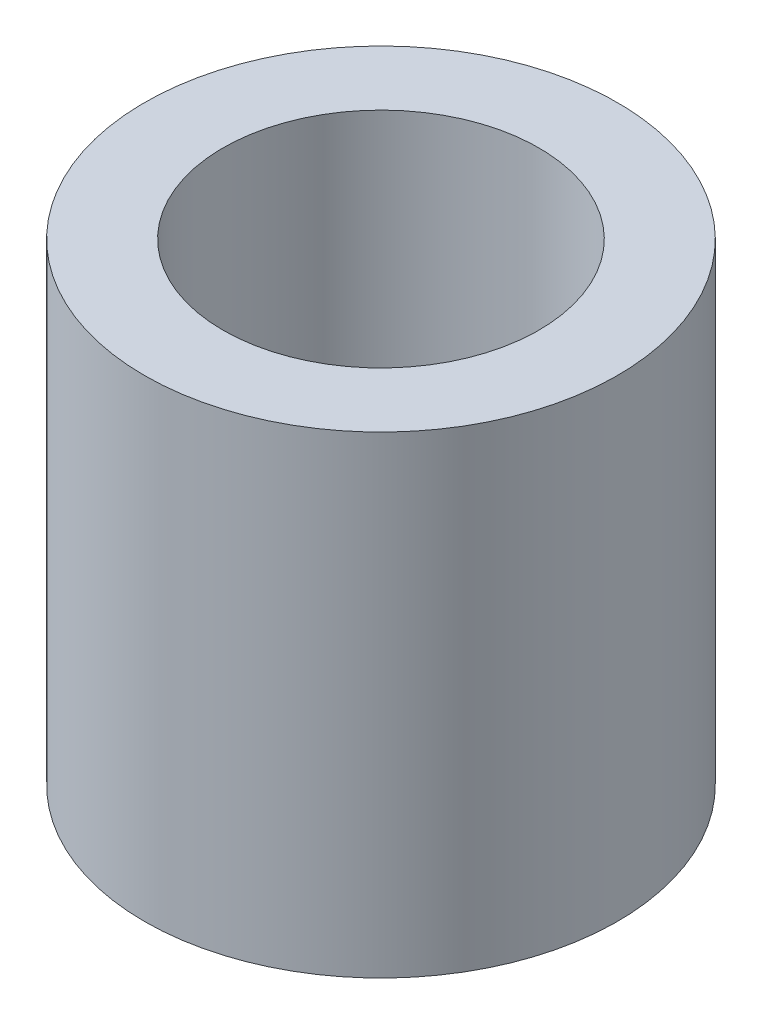
ISO-10303-21;
HEADER;
FILE_DESCRIPTION(('STEP AP214'),'2;1');
FILE_NAME('part.step','',(''),(''),'','','');
FILE_SCHEMA(('AUTOMOTIVE_DESIGN { 1 0 10303 214 1 1 1 1 }'));
ENDSEC;
DATA;
#1=APPLICATION_CONTEXT('core data for automotive mechanical design processes');
#2=APPLICATION_PROTOCOL_DEFINITION('international standard','automotive_design',2000,#1);
#3=PRODUCT_CONTEXT('',#1,'mechanical');
#4=PRODUCT('Part','Part','',(#3));
#5=PRODUCT_RELATED_PRODUCT_CATEGORY('part','',(#4));
#6=PRODUCT_DEFINITION_FORMATION('','',#4);
#7=PRODUCT_DEFINITION_CONTEXT('part definition',#1,'design');
#8=PRODUCT_DEFINITION('design','',#6,#7);
#9=PRODUCT_DEFINITION_SHAPE('','',#8);
#10=(LENGTH_UNIT() NAMED_UNIT(*) SI_UNIT(.MILLI.,.METRE.));
#11=(NAMED_UNIT(*) PLANE_ANGLE_UNIT() SI_UNIT($,.RADIAN.));
#12=(NAMED_UNIT(*) SI_UNIT($,.STERADIAN.) SOLID_ANGLE_UNIT());
#13=UNCERTAINTY_MEASURE_WITH_UNIT(LENGTH_MEASURE(1.E-05),#10,'distance_accuracy_value','');
#14=(GEOMETRIC_REPRESENTATION_CONTEXT(3) GLOBAL_UNCERTAINTY_ASSIGNED_CONTEXT((#13)) GLOBAL_UNIT_ASSIGNED_CONTEXT((#10,
#11,#12)) REPRESENTATION_CONTEXT('',''));
#15=CARTESIAN_POINT('',(0.,0.,0.));
#16=DIRECTION('',(0.,0.,1.));
#17=DIRECTION('',(1.,0.,0.));
#18=AXIS2_PLACEMENT_3D('',#15,#16,#17);
#19=CARTESIAN_POINT('',(0.,50.8,0.));
#20=DIRECTION('',(0.,1.,0.));
#21=DIRECTION('',(0.,0.,1.));
#22=AXIS2_PLACEMENT_3D('',#19,#20,#21);
#23=PLANE('',#22);
#24=CARTESIAN_POINT('',(0.,50.8,0.));
#25=DIRECTION('',(0.,1.,0.));
#26=DIRECTION('',(0.,0.,1.));
#27=AXIS2_PLACEMENT_3D('',#24,#25,#26);
#28=CIRCLE('',#27,25.4);
#29=CARTESIAN_POINT('',(0.,50.8,25.4));
#30=VERTEX_POINT('',#29);
#31=EDGE_CURVE('E10',#30,#30,#28,.T.);
#32=ORIENTED_EDGE('',*,*,#31,.T.);
#33=EDGE_LOOP('',(#32));
#34=FACE_BOUND('',#33,.T.);
#35=CARTESIAN_POINT('',(0.,50.8,0.));
#36=DIRECTION('',(0.,1.,0.));
#37=DIRECTION('',(0.,0.,1.));
#38=AXIS2_PLACEMENT_3D('',#35,#36,#37);
#39=CIRCLE('',#38,16.968374901095);
#40=CARTESIAN_POINT('',(0.,50.8,16.968374901095));
#41=VERTEX_POINT('',#40);
#42=EDGE_CURVE('E42',#41,#41,#39,.T.);
#43=ORIENTED_EDGE('',*,*,#42,.F.);
#44=EDGE_LOOP('',(#43));
#45=FACE_BOUND('',#44,.T.);
#46=ADVANCED_FACE('F31',(#34,#45),#23,.T.);
#47=CARTESIAN_POINT('',(0.,0.,0.));
#48=DIRECTION('',(0.,1.,0.));
#49=DIRECTION('',(0.,0.,1.));
#50=AXIS2_PLACEMENT_3D('',#47,#48,#49);
#51=PLANE('',#50);
#52=CARTESIAN_POINT('',(0.,0.,0.));
#53=DIRECTION('',(0.,1.,0.));
#54=DIRECTION('',(0.,0.,1.));
#55=AXIS2_PLACEMENT_3D('',#52,#53,#54);
#56=CIRCLE('',#55,25.4);
#57=CARTESIAN_POINT('',(0.,0.,25.4));
#58=VERTEX_POINT('',#57);
#59=EDGE_CURVE('E35',#58,#58,#56,.T.);
#60=ORIENTED_EDGE('',*,*,#59,.F.);
#61=EDGE_LOOP('',(#60));
#62=FACE_BOUND('',#61,.T.);
#63=CARTESIAN_POINT('',(0.,0.,0.));
#64=DIRECTION('',(0.,1.,0.));
#65=DIRECTION('',(0.,0.,1.));
#66=AXIS2_PLACEMENT_3D('',#63,#64,#65);
#67=CIRCLE('',#66,16.968374901095);
#68=CARTESIAN_POINT('',(0.,0.,16.968374901095));
#69=VERTEX_POINT('',#68);
#70=EDGE_CURVE('E44',#69,#69,#67,.T.);
#71=ORIENTED_EDGE('',*,*,#70,.T.);
#72=EDGE_LOOP('',(#71));
#73=FACE_BOUND('',#72,.T.);
#74=ADVANCED_FACE('F54',(#62,#73),#51,.F.);
#75=CARTESIAN_POINT('',(0.,50.8,0.));
#76=DIRECTION('',(0.,-1.,0.));
#77=DIRECTION('',(0.,0.,-1.));
#78=AXIS2_PLACEMENT_3D('',#75,#76,#77);
#79=CYLINDRICAL_SURFACE('',#78,25.4);
#80=ORIENTED_EDGE('',*,*,#31,.F.);
#81=EDGE_LOOP('',(#80));
#82=FACE_BOUND('',#81,.T.);
#83=ORIENTED_EDGE('',*,*,#59,.T.);
#84=EDGE_LOOP('',(#83));
#85=FACE_BOUND('',#84,.T.);
#86=ADVANCED_FACE('F33',(#82,#85),#79,.T.);
#87=CARTESIAN_POINT('',(0.,50.8,0.));
#88=DIRECTION('',(0.,-1.,0.));
#89=DIRECTION('',(0.,0.,-1.));
#90=AXIS2_PLACEMENT_3D('',#87,#88,#89);
#91=CYLINDRICAL_SURFACE('',#90,16.968374901095);
#92=ORIENTED_EDGE('',*,*,#42,.T.);
#93=EDGE_LOOP('',(#92));
#94=FACE_BOUND('',#93,.T.);
#95=ORIENTED_EDGE('',*,*,#70,.F.);
#96=EDGE_LOOP('',(#95));
#97=FACE_BOUND('',#96,.T.);
#98=ADVANCED_FACE('F50',(#94,#97),#91,.F.);
#99=CLOSED_SHELL('',(#46,#74,#86,#98));
#100=MANIFOLD_SOLID_BREP('B2',#99);
#101=ADVANCED_BREP_SHAPE_REPRESENTATION('',(#18,#100),#14);
#102=SHAPE_DEFINITION_REPRESENTATION(#9,#101);
ENDSEC;
END-ISO-10303-21;
